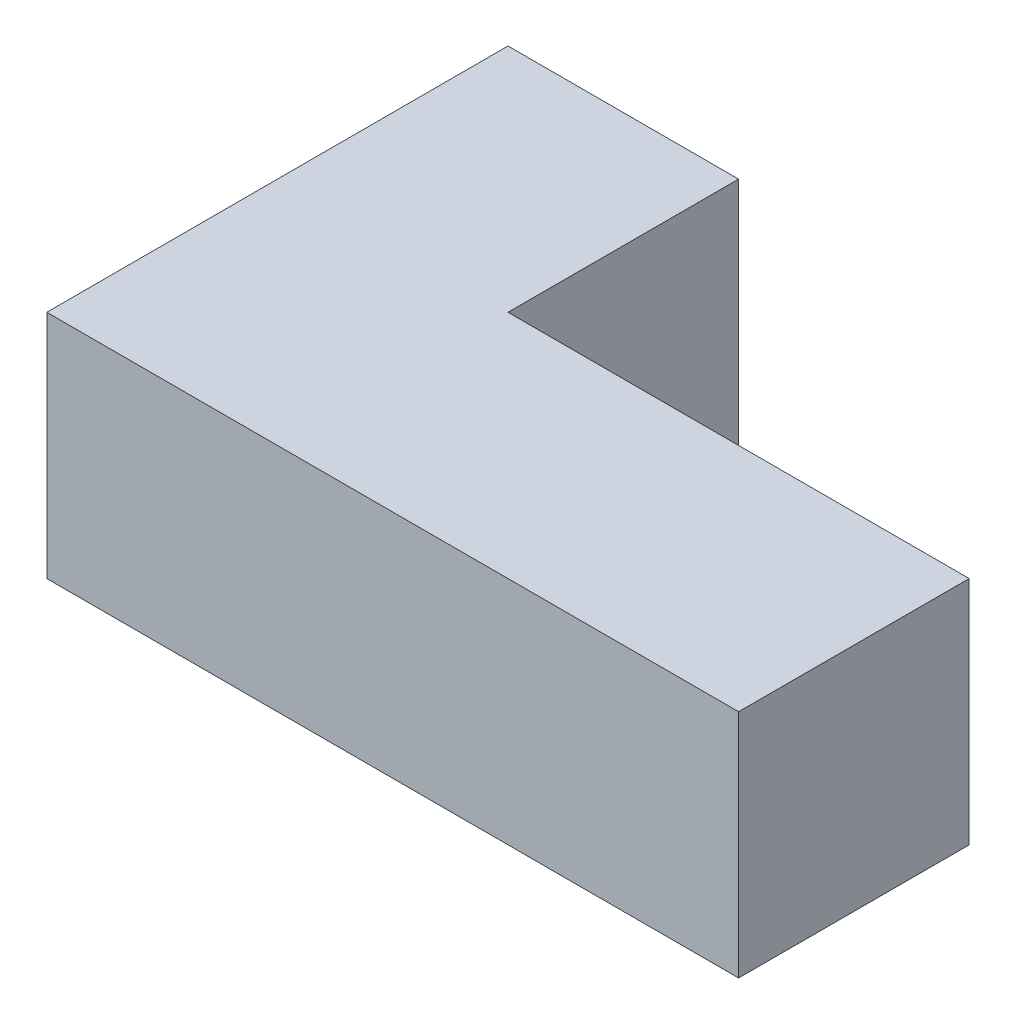
ISO-10303-21;
HEADER;
FILE_DESCRIPTION(('STEP AP214'),'2;1');
FILE_NAME('part.step','',(''),(''),'','','');
FILE_SCHEMA(('AUTOMOTIVE_DESIGN { 1 0 10303 214 1 1 1 1 }'));
ENDSEC;
DATA;
#1=APPLICATION_CONTEXT('core data for automotive mechanical design processes');
#2=APPLICATION_PROTOCOL_DEFINITION('international standard','automotive_design',2000,#1);
#3=PRODUCT_CONTEXT('',#1,'mechanical');
#4=PRODUCT('Part','Part','',(#3));
#5=PRODUCT_RELATED_PRODUCT_CATEGORY('part','',(#4));
#6=PRODUCT_DEFINITION_FORMATION('','',#4);
#7=PRODUCT_DEFINITION_CONTEXT('part definition',#1,'design');
#8=PRODUCT_DEFINITION('design','',#6,#7);
#9=PRODUCT_DEFINITION_SHAPE('','',#8);
#10=(LENGTH_UNIT() NAMED_UNIT(*) SI_UNIT(.MILLI.,.METRE.));
#11=(NAMED_UNIT(*) PLANE_ANGLE_UNIT() SI_UNIT($,.RADIAN.));
#12=(NAMED_UNIT(*) SI_UNIT($,.STERADIAN.) SOLID_ANGLE_UNIT());
#13=UNCERTAINTY_MEASURE_WITH_UNIT(LENGTH_MEASURE(1.E-05),#10,'distance_accuracy_value','');
#14=(GEOMETRIC_REPRESENTATION_CONTEXT(3) GLOBAL_UNCERTAINTY_ASSIGNED_CONTEXT((#13)) GLOBAL_UNIT_ASSIGNED_CONTEXT((#10,
#11,#12)) REPRESENTATION_CONTEXT('',''));
#15=CARTESIAN_POINT('',(0.,0.,0.));
#16=DIRECTION('',(0.,0.,1.));
#17=DIRECTION('',(1.,0.,0.));
#18=AXIS2_PLACEMENT_3D('',#15,#16,#17);
#19=CARTESIAN_POINT('',(0.,30.,0.));
#20=DIRECTION('',(0.,0.,-1.));
#21=DIRECTION('',(-1.,0.,0.));
#22=AXIS2_PLACEMENT_3D('',#19,#20,#21);
#23=PLANE('',#22);
#24=DIRECTION('',(1.,0.,0.));
#25=VECTOR('',#24,1.);
#26=CARTESIAN_POINT('',(0.,0.,0.));
#27=LINE('',#26,#25);
#28=CARTESIAN_POINT('',(0.,0.,0.));
#29=VERTEX_POINT('',#28);
#30=CARTESIAN_POINT('',(90.,0.,0.));
#31=VERTEX_POINT('',#30);
#32=EDGE_CURVE('E88',#29,#31,#27,.T.);
#33=ORIENTED_EDGE('',*,*,#32,.T.);
#34=DIRECTION('',(0.,-1.,0.));
#35=VECTOR('',#34,1.);
#36=CARTESIAN_POINT('',(90.,30.,0.));
#37=LINE('',#36,#35);
#38=CARTESIAN_POINT('',(90.,30.,0.));
#39=VERTEX_POINT('',#38);
#40=EDGE_CURVE('E91',#39,#31,#37,.T.);
#41=ORIENTED_EDGE('',*,*,#40,.F.);
#42=DIRECTION('',(1.,0.,0.));
#43=VECTOR('',#42,1.);
#44=CARTESIAN_POINT('',(0.,30.,0.));
#45=LINE('',#44,#43);
#46=CARTESIAN_POINT('',(0.,30.,0.));
#47=VERTEX_POINT('',#46);
#48=EDGE_CURVE('E113',#47,#39,#45,.T.);
#49=ORIENTED_EDGE('',*,*,#48,.F.);
#50=DIRECTION('',(0.,-1.,0.));
#51=VECTOR('',#50,1.);
#52=CARTESIAN_POINT('',(0.,30.,0.));
#53=LINE('',#52,#51);
#54=EDGE_CURVE('E51',#47,#29,#53,.T.);
#55=ORIENTED_EDGE('',*,*,#54,.T.);
#56=EDGE_LOOP('',(#33,#41,#49,#55));
#57=FACE_BOUND('',#56,.T.);
#58=ADVANCED_FACE('F35',(#57),#23,.F.);
#59=CARTESIAN_POINT('',(0.,30.,-30.));
#60=DIRECTION('',(0.,0.,-1.));
#61=DIRECTION('',(-1.,0.,0.));
#62=AXIS2_PLACEMENT_3D('',#59,#60,#61);
#63=PLANE('',#62);
#64=DIRECTION('',(1.,0.,0.));
#65=VECTOR('',#64,1.);
#66=CARTESIAN_POINT('',(0.,0.,-30.));
#67=LINE('',#66,#65);
#68=CARTESIAN_POINT('',(30.,0.,-30.));
#69=VERTEX_POINT('',#68);
#70=CARTESIAN_POINT('',(90.,0.,-30.));
#71=VERTEX_POINT('',#70);
#72=EDGE_CURVE('E94',#69,#71,#67,.T.);
#73=ORIENTED_EDGE('',*,*,#72,.F.);
#74=DIRECTION('',(0.,-1.,0.));
#75=VECTOR('',#74,1.);
#76=CARTESIAN_POINT('',(30.,30.,-30.));
#77=LINE('',#76,#75);
#78=CARTESIAN_POINT('',(30.,30.,-30.));
#79=VERTEX_POINT('',#78);
#80=EDGE_CURVE('E11',#79,#69,#77,.T.);
#81=ORIENTED_EDGE('',*,*,#80,.F.);
#82=DIRECTION('',(1.,0.,0.));
#83=VECTOR('',#82,1.);
#84=CARTESIAN_POINT('',(0.,30.,-30.));
#85=LINE('',#84,#83);
#86=CARTESIAN_POINT('',(90.,30.,-30.));
#87=VERTEX_POINT('',#86);
#88=EDGE_CURVE('E115',#79,#87,#85,.T.);
#89=ORIENTED_EDGE('',*,*,#88,.T.);
#90=DIRECTION('',(0.,1.,0.));
#91=VECTOR('',#90,1.);
#92=CARTESIAN_POINT('',(90.,0.,-30.));
#93=LINE('',#92,#91);
#94=EDGE_CURVE('E104',#71,#87,#93,.T.);
#95=ORIENTED_EDGE('',*,*,#94,.F.);
#96=EDGE_LOOP('',(#73,#81,#89,#95));
#97=FACE_BOUND('',#96,.T.);
#98=ADVANCED_FACE('F153',(#97),#63,.T.);
#99=CARTESIAN_POINT('',(30.,30.,0.));
#100=DIRECTION('',(-1.,0.,0.));
#101=DIRECTION('',(0.,0.,1.));
#102=AXIS2_PLACEMENT_3D('',#99,#100,#101);
#103=PLANE('',#102);
#104=DIRECTION('',(0.,0.,-1.));
#105=VECTOR('',#104,1.);
#106=CARTESIAN_POINT('',(30.,0.,0.));
#107=LINE('',#106,#105);
#108=CARTESIAN_POINT('',(30.,0.,-60.));
#109=VERTEX_POINT('',#108);
#110=EDGE_CURVE('E126',#69,#109,#107,.T.);
#111=ORIENTED_EDGE('',*,*,#110,.T.);
#112=DIRECTION('',(0.,-1.,0.));
#113=VECTOR('',#112,1.);
#114=CARTESIAN_POINT('',(30.,30.,-60.));
#115=LINE('',#114,#113);
#116=CARTESIAN_POINT('',(30.,30.,-60.));
#117=VERTEX_POINT('',#116);
#118=EDGE_CURVE('E43',#117,#109,#115,.T.);
#119=ORIENTED_EDGE('',*,*,#118,.F.);
#120=DIRECTION('',(0.,0.,-1.));
#121=VECTOR('',#120,1.);
#122=CARTESIAN_POINT('',(30.,30.,0.));
#123=LINE('',#122,#121);
#124=EDGE_CURVE('E118',#79,#117,#123,.T.);
#125=ORIENTED_EDGE('',*,*,#124,.F.);
#126=ORIENTED_EDGE('',*,*,#80,.T.);
#127=EDGE_LOOP('',(#111,#119,#125,#126));
#128=FACE_BOUND('',#127,.T.);
#129=ADVANCED_FACE('F139',(#128),#103,.F.);
#130=CARTESIAN_POINT('',(0.,30.,-60.));
#131=DIRECTION('',(0.,0.,-1.));
#132=DIRECTION('',(-1.,0.,0.));
#133=AXIS2_PLACEMENT_3D('',#130,#131,#132);
#134=PLANE('',#133);
#135=DIRECTION('',(1.,0.,0.));
#136=VECTOR('',#135,1.);
#137=CARTESIAN_POINT('',(0.,0.,-60.));
#138=LINE('',#137,#136);
#139=CARTESIAN_POINT('',(0.,0.,-60.));
#140=VERTEX_POINT('',#139);
#141=EDGE_CURVE('E129',#140,#109,#138,.T.);
#142=ORIENTED_EDGE('',*,*,#141,.F.);
#143=DIRECTION('',(0.,-1.,0.));
#144=VECTOR('',#143,1.);
#145=CARTESIAN_POINT('',(0.,30.,-60.));
#146=LINE('',#145,#144);
#147=CARTESIAN_POINT('',(0.,30.,-60.));
#148=VERTEX_POINT('',#147);
#149=EDGE_CURVE('E65',#148,#140,#146,.T.);
#150=ORIENTED_EDGE('',*,*,#149,.F.);
#151=DIRECTION('',(1.,0.,0.));
#152=VECTOR('',#151,1.);
#153=CARTESIAN_POINT('',(0.,30.,-60.));
#154=LINE('',#153,#152);
#155=EDGE_CURVE('E120',#148,#117,#154,.T.);
#156=ORIENTED_EDGE('',*,*,#155,.T.);
#157=ORIENTED_EDGE('',*,*,#118,.T.);
#158=EDGE_LOOP('',(#142,#150,#156,#157));
#159=FACE_BOUND('',#158,.T.);
#160=ADVANCED_FACE('F136',(#159),#134,.T.);
#161=CARTESIAN_POINT('',(0.,30.,0.));
#162=DIRECTION('',(-1.,0.,0.));
#163=DIRECTION('',(0.,0.,1.));
#164=AXIS2_PLACEMENT_3D('',#161,#162,#163);
#165=PLANE('',#164);
#166=DIRECTION('',(0.,0.,-1.));
#167=VECTOR('',#166,1.);
#168=CARTESIAN_POINT('',(0.,0.,0.));
#169=LINE('',#168,#167);
#170=EDGE_CURVE('E116',#29,#140,#169,.T.);
#171=ORIENTED_EDGE('',*,*,#170,.F.);
#172=ORIENTED_EDGE('',*,*,#54,.F.);
#173=DIRECTION('',(0.,0.,-1.));
#174=VECTOR('',#173,1.);
#175=CARTESIAN_POINT('',(0.,30.,0.));
#176=LINE('',#175,#174);
#177=EDGE_CURVE('E123',#47,#148,#176,.T.);
#178=ORIENTED_EDGE('',*,*,#177,.T.);
#179=ORIENTED_EDGE('',*,*,#149,.T.);
#180=EDGE_LOOP('',(#171,#172,#178,#179));
#181=FACE_BOUND('',#180,.T.);
#182=ADVANCED_FACE('F140',(#181),#165,.T.);
#183=CARTESIAN_POINT('',(0.,30.,0.));
#184=DIRECTION('',(0.,1.,0.));
#185=DIRECTION('',(0.,0.,1.));
#186=AXIS2_PLACEMENT_3D('',#183,#184,#185);
#187=PLANE('',#186);
#188=ORIENTED_EDGE('',*,*,#48,.T.);
#189=DIRECTION('',(0.,0.,1.));
#190=VECTOR('',#189,1.);
#191=CARTESIAN_POINT('',(90.,30.,-30.));
#192=LINE('',#191,#190);
#193=EDGE_CURVE('E95',#87,#39,#192,.T.);
#194=ORIENTED_EDGE('',*,*,#193,.F.);
#195=ORIENTED_EDGE('',*,*,#88,.F.);
#196=ORIENTED_EDGE('',*,*,#124,.T.);
#197=ORIENTED_EDGE('',*,*,#155,.F.);
#198=ORIENTED_EDGE('',*,*,#177,.F.);
#199=EDGE_LOOP('',(#188,#194,#195,#196,#197,#198));
#200=FACE_BOUND('',#199,.T.);
#201=ADVANCED_FACE('F142',(#200),#187,.T.);
#202=CARTESIAN_POINT('',(0.,0.,0.));
#203=DIRECTION('',(0.,1.,0.));
#204=DIRECTION('',(0.,0.,1.));
#205=AXIS2_PLACEMENT_3D('',#202,#203,#204);
#206=PLANE('',#205);
#207=ORIENTED_EDGE('',*,*,#32,.F.);
#208=ORIENTED_EDGE('',*,*,#170,.T.);
#209=ORIENTED_EDGE('',*,*,#141,.T.);
#210=ORIENTED_EDGE('',*,*,#110,.F.);
#211=ORIENTED_EDGE('',*,*,#72,.T.);
#212=DIRECTION('',(0.,0.,-1.));
#213=VECTOR('',#212,1.);
#214=CARTESIAN_POINT('',(90.,0.,0.));
#215=LINE('',#214,#213);
#216=EDGE_CURVE('E98',#31,#71,#215,.T.);
#217=ORIENTED_EDGE('',*,*,#216,.F.);
#218=EDGE_LOOP('',(#207,#208,#209,#210,#211,#217));
#219=FACE_BOUND('',#218,.T.);
#220=ADVANCED_FACE('F99',(#219),#206,.F.);
#221=CARTESIAN_POINT('',(90.,0.,0.));
#222=DIRECTION('',(1.,0.,0.));
#223=DIRECTION('',(0.,0.,-1.));
#224=AXIS2_PLACEMENT_3D('',#221,#222,#223);
#225=PLANE('',#224);
#226=ORIENTED_EDGE('',*,*,#40,.T.);
#227=ORIENTED_EDGE('',*,*,#216,.T.);
#228=ORIENTED_EDGE('',*,*,#94,.T.);
#229=ORIENTED_EDGE('',*,*,#193,.T.);
#230=EDGE_LOOP('',(#226,#227,#228,#229));
#231=FACE_BOUND('',#230,.T.);
#232=ADVANCED_FACE('F107',(#231),#225,.T.);
#233=CLOSED_SHELL('',(#58,#98,#129,#160,#182,#201,#220,#232));
#234=MANIFOLD_SOLID_BREP('B2',#233);
#235=ADVANCED_BREP_SHAPE_REPRESENTATION('',(#18,#234),#14);
#236=SHAPE_DEFINITION_REPRESENTATION(#9,#235);
ENDSEC;
END-ISO-10303-21;
